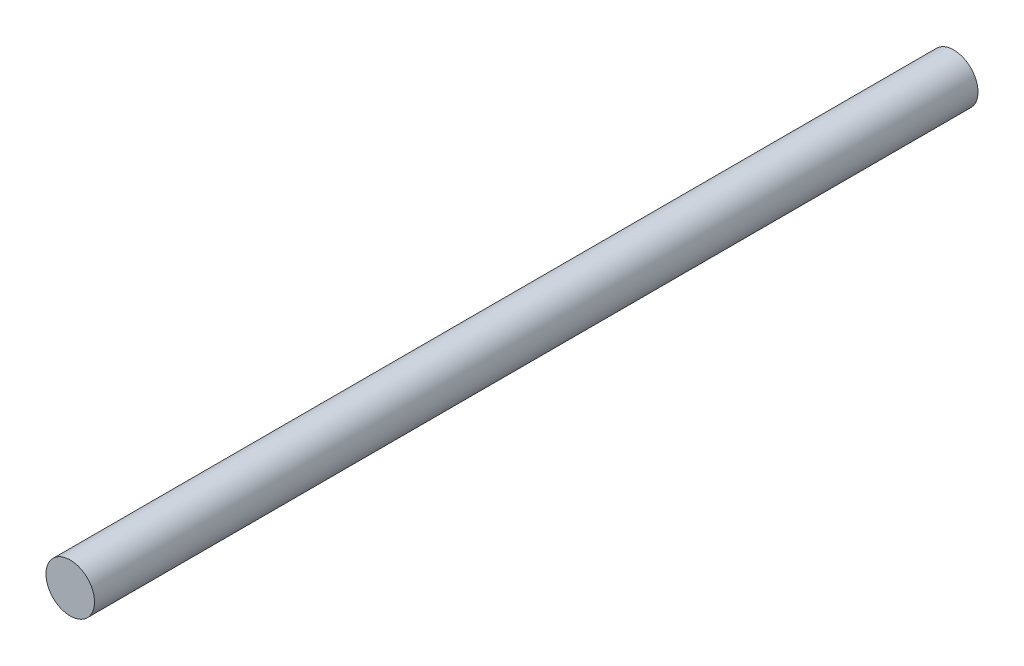
ISO-10303-21;
HEADER;
FILE_DESCRIPTION(('STEP AP214'),'2;1');
FILE_NAME('part.step','',(''),(''),'','','');
FILE_SCHEMA(('AUTOMOTIVE_DESIGN { 1 0 10303 214 1 1 1 1 }'));
ENDSEC;
DATA;
#1=APPLICATION_CONTEXT('core data for automotive mechanical design processes');
#2=APPLICATION_PROTOCOL_DEFINITION('international standard','automotive_design',2000,#1);
#3=PRODUCT_CONTEXT('',#1,'mechanical');
#4=PRODUCT('Part','Part','',(#3));
#5=PRODUCT_RELATED_PRODUCT_CATEGORY('part','',(#4));
#6=PRODUCT_DEFINITION_FORMATION('','',#4);
#7=PRODUCT_DEFINITION_CONTEXT('part definition',#1,'design');
#8=PRODUCT_DEFINITION('design','',#6,#7);
#9=PRODUCT_DEFINITION_SHAPE('','',#8);
#10=(LENGTH_UNIT() NAMED_UNIT(*) SI_UNIT(.MILLI.,.METRE.));
#11=(NAMED_UNIT(*) PLANE_ANGLE_UNIT() SI_UNIT($,.RADIAN.));
#12=(NAMED_UNIT(*) SI_UNIT($,.STERADIAN.) SOLID_ANGLE_UNIT());
#13=UNCERTAINTY_MEASURE_WITH_UNIT(LENGTH_MEASURE(1.E-05),#10,'distance_accuracy_value','');
#14=(GEOMETRIC_REPRESENTATION_CONTEXT(3) GLOBAL_UNCERTAINTY_ASSIGNED_CONTEXT((#13)) GLOBAL_UNIT_ASSIGNED_CONTEXT((#10,
#11,#12)) REPRESENTATION_CONTEXT('',''));
#15=CARTESIAN_POINT('',(0.,0.,0.));
#16=DIRECTION('',(0.,0.,1.));
#17=DIRECTION('',(1.,0.,0.));
#18=AXIS2_PLACEMENT_3D('',#15,#16,#17);
#19=CARTESIAN_POINT('',(0.,0.,182.));
#20=DIRECTION('',(0.,0.,-1.));
#21=DIRECTION('',(-1.,0.,0.));
#22=AXIS2_PLACEMENT_3D('',#19,#20,#21);
#23=CYLINDRICAL_SURFACE('',#22,5.);
#24=CARTESIAN_POINT('',(0.,0.,182.));
#25=DIRECTION('',(0.,0.,1.));
#26=DIRECTION('',(1.,0.,0.));
#27=AXIS2_PLACEMENT_3D('',#24,#25,#26);
#28=CIRCLE('',#27,5.);
#29=CARTESIAN_POINT('',(5.,0.,182.));
#30=VERTEX_POINT('',#29);
#31=EDGE_CURVE('E10',#30,#30,#28,.T.);
#32=ORIENTED_EDGE('',*,*,#31,.F.);
#33=EDGE_LOOP('',(#32));
#34=FACE_BOUND('',#33,.T.);
#35=CARTESIAN_POINT('',(0.,0.,0.));
#36=DIRECTION('',(0.,0.,1.));
#37=DIRECTION('',(1.,0.,0.));
#38=AXIS2_PLACEMENT_3D('',#35,#36,#37);
#39=CIRCLE('',#38,5.);
#40=CARTESIAN_POINT('',(5.,0.,0.));
#41=VERTEX_POINT('',#40);
#42=EDGE_CURVE('E36',#41,#41,#39,.T.);
#43=ORIENTED_EDGE('',*,*,#42,.T.);
#44=EDGE_LOOP('',(#43));
#45=FACE_BOUND('',#44,.T.);
#46=ADVANCED_FACE('F33',(#34,#45),#23,.T.);
#47=CARTESIAN_POINT('',(0.,0.,182.));
#48=DIRECTION('',(0.,0.,1.));
#49=DIRECTION('',(1.,0.,0.));
#50=AXIS2_PLACEMENT_3D('',#47,#48,#49);
#51=PLANE('',#50);
#52=ORIENTED_EDGE('',*,*,#31,.T.);
#53=EDGE_LOOP('',(#52));
#54=FACE_BOUND('',#53,.T.);
#55=ADVANCED_FACE('F48',(#54),#51,.T.);
#56=CARTESIAN_POINT('',(0.,0.,0.));
#57=DIRECTION('',(0.,0.,1.));
#58=DIRECTION('',(1.,0.,0.));
#59=AXIS2_PLACEMENT_3D('',#56,#57,#58);
#60=PLANE('',#59);
#61=ORIENTED_EDGE('',*,*,#42,.F.);
#62=EDGE_LOOP('',(#61));
#63=FACE_BOUND('',#62,.T.);
#64=ADVANCED_FACE('F46',(#63),#60,.F.);
#65=CLOSED_SHELL('',(#46,#55,#64));
#66=MANIFOLD_SOLID_BREP('B2',#65);
#67=ADVANCED_BREP_SHAPE_REPRESENTATION('',(#18,#66),#14);
#68=SHAPE_DEFINITION_REPRESENTATION(#9,#67);
ENDSEC;
END-ISO-10303-21;
